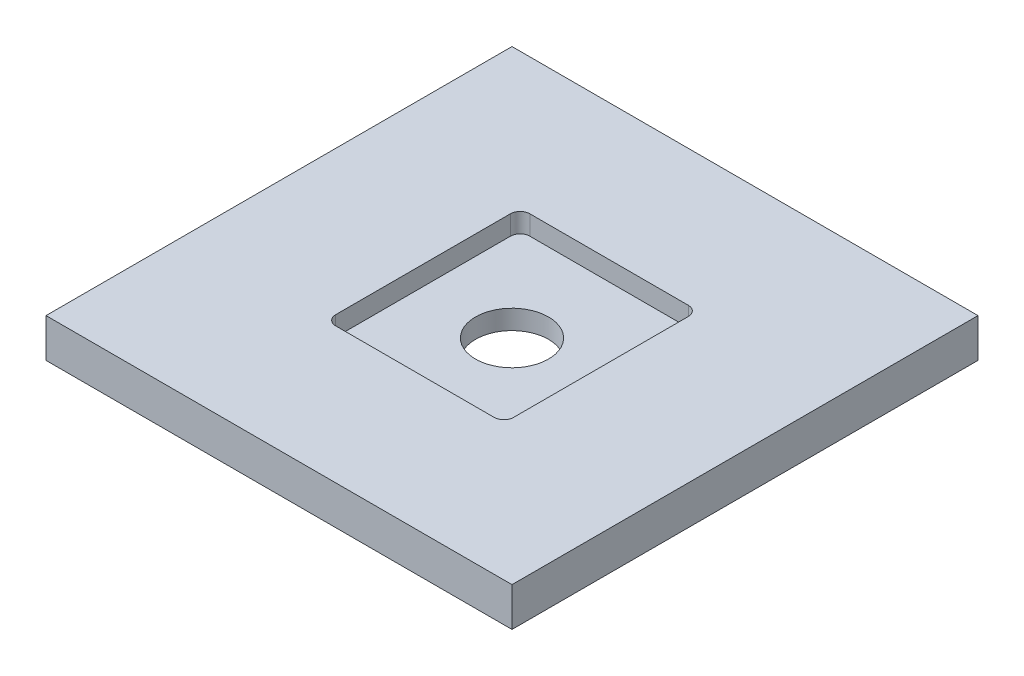
ISO-10303-21;
HEADER;
FILE_DESCRIPTION(('STEP AP214'),'2;1');
FILE_NAME('part.step','',(''),(''),'','','');
FILE_SCHEMA(('AUTOMOTIVE_DESIGN { 1 0 10303 214 1 1 1 1 }'));
ENDSEC;
DATA;
#1=APPLICATION_CONTEXT('core data for automotive mechanical design processes');
#2=APPLICATION_PROTOCOL_DEFINITION('international standard','automotive_design',2000,#1);
#3=PRODUCT_CONTEXT('',#1,'mechanical');
#4=PRODUCT('Part','Part','',(#3));
#5=PRODUCT_RELATED_PRODUCT_CATEGORY('part','',(#4));
#6=PRODUCT_DEFINITION_FORMATION('','',#4);
#7=PRODUCT_DEFINITION_CONTEXT('part definition',#1,'design');
#8=PRODUCT_DEFINITION('design','',#6,#7);
#9=PRODUCT_DEFINITION_SHAPE('','',#8);
#10=(LENGTH_UNIT() NAMED_UNIT(*) SI_UNIT(.MILLI.,.METRE.));
#11=(NAMED_UNIT(*) PLANE_ANGLE_UNIT() SI_UNIT($,.RADIAN.));
#12=(NAMED_UNIT(*) SI_UNIT($,.STERADIAN.) SOLID_ANGLE_UNIT());
#13=UNCERTAINTY_MEASURE_WITH_UNIT(LENGTH_MEASURE(1.E-05),#10,'distance_accuracy_value','');
#14=(GEOMETRIC_REPRESENTATION_CONTEXT(3) GLOBAL_UNCERTAINTY_ASSIGNED_CONTEXT((#13)) GLOBAL_UNIT_ASSIGNED_CONTEXT((#10,
#11,#12)) REPRESENTATION_CONTEXT('',''));
#15=CARTESIAN_POINT('',(0.,0.,0.));
#16=DIRECTION('',(0.,0.,1.));
#17=DIRECTION('',(1.,0.,0.));
#18=AXIS2_PLACEMENT_3D('',#15,#16,#17);
#19=CARTESIAN_POINT('',(0.,12.7,0.));
#20=DIRECTION('',(0.,1.,0.));
#21=DIRECTION('',(0.,0.,1.));
#22=AXIS2_PLACEMENT_3D('',#19,#20,#21);
#23=PLANE('',#22);
#24=DIRECTION('',(0.,0.,-1.));
#25=VECTOR('',#24,1.);
#26=CARTESIAN_POINT('',(152.4,12.7,-152.4));
#27=LINE('',#26,#25);
#28=CARTESIAN_POINT('',(152.4,12.7,152.4));
#29=VERTEX_POINT('',#28);
#30=CARTESIAN_POINT('',(152.4,12.7,-152.4));
#31=VERTEX_POINT('',#30);
#32=EDGE_CURVE('E173',#29,#31,#27,.T.);
#33=ORIENTED_EDGE('',*,*,#32,.T.);
#34=DIRECTION('',(-1.,0.,0.));
#35=VECTOR('',#34,1.);
#36=CARTESIAN_POINT('',(-152.4,12.7,-152.4));
#37=LINE('',#36,#35);
#38=CARTESIAN_POINT('',(-152.4,12.7,-152.4));
#39=VERTEX_POINT('',#38);
#40=EDGE_CURVE('E186',#31,#39,#37,.T.);
#41=ORIENTED_EDGE('',*,*,#40,.T.);
#42=DIRECTION('',(0.,0.,1.));
#43=VECTOR('',#42,1.);
#44=CARTESIAN_POINT('',(-152.4,12.7,-152.4));
#45=LINE('',#44,#43);
#46=CARTESIAN_POINT('',(-152.4,12.7,152.4));
#47=VERTEX_POINT('',#46);
#48=EDGE_CURVE('E132',#39,#47,#45,.T.);
#49=ORIENTED_EDGE('',*,*,#48,.T.);
#50=DIRECTION('',(1.,0.,0.));
#51=VECTOR('',#50,1.);
#52=CARTESIAN_POINT('',(-152.4,12.7,152.4));
#53=LINE('',#52,#51);
#54=EDGE_CURVE('E189',#47,#29,#53,.T.);
#55=ORIENTED_EDGE('',*,*,#54,.T.);
#56=EDGE_LOOP('',(#33,#41,#49,#55));
#57=FACE_BOUND('',#56,.T.);
#58=DIRECTION('',(-1.,0.,0.));
#59=VECTOR('',#58,1.);
#60=CARTESIAN_POINT('',(-58.1853153841649,12.7,-63.5));
#61=LINE('',#60,#59);
#62=CARTESIAN_POINT('',(51.835315384165,12.7,-63.5));
#63=VERTEX_POINT('',#62);
#64=CARTESIAN_POINT('',(-51.8353153841649,12.7,-63.5));
#65=VERTEX_POINT('',#64);
#66=EDGE_CURVE('E164',#63,#65,#61,.T.);
#67=ORIENTED_EDGE('',*,*,#66,.F.);
#68=CARTESIAN_POINT('',(51.835315384165,12.7,-57.15));
#69=DIRECTION('',(0.,1.,0.));
#70=DIRECTION('',(0.,0.,1.));
#71=AXIS2_PLACEMENT_3D('',#68,#69,#70);
#72=CIRCLE('',#71,6.35);
#73=CARTESIAN_POINT('',(58.185315384165,12.7,-57.15));
#74=VERTEX_POINT('',#73);
#75=EDGE_CURVE('E227',#63,#74,#72,.F.);
#76=ORIENTED_EDGE('',*,*,#75,.T.);
#77=DIRECTION('',(0.,0.,-1.));
#78=VECTOR('',#77,1.);
#79=CARTESIAN_POINT('',(58.185315384165,12.7,63.5));
#80=LINE('',#79,#78);
#81=CARTESIAN_POINT('',(58.185315384165,12.7,57.15));
#82=VERTEX_POINT('',#81);
#83=EDGE_CURVE('E161',#82,#74,#80,.T.);
#84=ORIENTED_EDGE('',*,*,#83,.F.);
#85=CARTESIAN_POINT('',(51.835315384165,12.7,57.15));
#86=DIRECTION('',(0.,1.,0.));
#87=DIRECTION('',(0.,0.,1.));
#88=AXIS2_PLACEMENT_3D('',#85,#86,#87);
#89=CIRCLE('',#88,6.35);
#90=CARTESIAN_POINT('',(51.835315384165,12.7,63.5));
#91=VERTEX_POINT('',#90);
#92=EDGE_CURVE('E222',#82,#91,#89,.F.);
#93=ORIENTED_EDGE('',*,*,#92,.T.);
#94=DIRECTION('',(1.,0.,0.));
#95=VECTOR('',#94,1.);
#96=CARTESIAN_POINT('',(-58.1853153841649,12.7,63.5));
#97=LINE('',#96,#95);
#98=CARTESIAN_POINT('',(-51.8353153841649,12.7,63.5));
#99=VERTEX_POINT('',#98);
#100=EDGE_CURVE('E170',#99,#91,#97,.T.);
#101=ORIENTED_EDGE('',*,*,#100,.F.);
#102=CARTESIAN_POINT('',(-51.8353153841649,12.7,57.15));
#103=DIRECTION('',(0.,1.,0.));
#104=DIRECTION('',(0.,0.,1.));
#105=AXIS2_PLACEMENT_3D('',#102,#103,#104);
#106=CIRCLE('',#105,6.35);
#107=CARTESIAN_POINT('',(-58.1853153841649,12.7,57.15));
#108=VERTEX_POINT('',#107);
#109=EDGE_CURVE('E217',#99,#108,#106,.F.);
#110=ORIENTED_EDGE('',*,*,#109,.T.);
#111=DIRECTION('',(0.,0.,1.));
#112=VECTOR('',#111,1.);
#113=CARTESIAN_POINT('',(-58.1853153841649,12.7,63.5));
#114=LINE('',#113,#112);
#115=CARTESIAN_POINT('',(-58.1853153841649,12.7,-57.15));
#116=VERTEX_POINT('',#115);
#117=EDGE_CURVE('E167',#116,#108,#114,.T.);
#118=ORIENTED_EDGE('',*,*,#117,.F.);
#119=CARTESIAN_POINT('',(-51.8353153841649,12.7,-57.15));
#120=DIRECTION('',(0.,1.,0.));
#121=DIRECTION('',(0.,0.,1.));
#122=AXIS2_PLACEMENT_3D('',#119,#120,#121);
#123=CIRCLE('',#122,6.35);
#124=EDGE_CURVE('E11',#116,#65,#123,.F.);
#125=ORIENTED_EDGE('',*,*,#124,.T.);
#126=EDGE_LOOP('',(#67,#76,#84,#93,#101,#110,#118,#125));
#127=FACE_BOUND('',#126,.T.);
#128=ADVANCED_FACE('F37',(#57,#127),#23,.T.);
#129=CARTESIAN_POINT('',(152.4,12.7,-152.4));
#130=DIRECTION('',(-1.,0.,0.));
#131=DIRECTION('',(0.,0.,1.));
#132=AXIS2_PLACEMENT_3D('',#129,#130,#131);
#133=PLANE('',#132);
#134=DIRECTION('',(0.,-1.,0.));
#135=VECTOR('',#134,1.);
#136=CARTESIAN_POINT('',(152.4,12.7,152.4));
#137=LINE('',#136,#135);
#138=CARTESIAN_POINT('',(152.4,-12.7,152.4));
#139=VERTEX_POINT('',#138);
#140=EDGE_CURVE('E191',#29,#139,#137,.T.);
#141=ORIENTED_EDGE('',*,*,#140,.T.);
#142=DIRECTION('',(0.,0.,1.));
#143=VECTOR('',#142,1.);
#144=CARTESIAN_POINT('',(152.4,-12.7,152.4));
#145=LINE('',#144,#143);
#146=CARTESIAN_POINT('',(152.4,-12.7,-152.4));
#147=VERTEX_POINT('',#146);
#148=EDGE_CURVE('E144',#147,#139,#145,.T.);
#149=ORIENTED_EDGE('',*,*,#148,.F.);
#150=DIRECTION('',(0.,-1.,0.));
#151=VECTOR('',#150,1.);
#152=CARTESIAN_POINT('',(152.4,12.7,-152.4));
#153=LINE('',#152,#151);
#154=EDGE_CURVE('E134',#31,#147,#153,.T.);
#155=ORIENTED_EDGE('',*,*,#154,.F.);
#156=ORIENTED_EDGE('',*,*,#32,.F.);
#157=EDGE_LOOP('',(#141,#149,#155,#156));
#158=FACE_BOUND('',#157,.T.);
#159=ADVANCED_FACE('F266',(#158),#133,.F.);
#160=CARTESIAN_POINT('',(-152.4,12.7,-152.4));
#161=DIRECTION('',(0.,0.,1.));
#162=DIRECTION('',(1.,0.,0.));
#163=AXIS2_PLACEMENT_3D('',#160,#161,#162);
#164=PLANE('',#163);
#165=ORIENTED_EDGE('',*,*,#154,.T.);
#166=DIRECTION('',(1.,0.,0.));
#167=VECTOR('',#166,1.);
#168=CARTESIAN_POINT('',(152.4,-12.7,-152.4));
#169=LINE('',#168,#167);
#170=CARTESIAN_POINT('',(-152.4,-12.7,-152.4));
#171=VERTEX_POINT('',#170);
#172=EDGE_CURVE('E138',#171,#147,#169,.T.);
#173=ORIENTED_EDGE('',*,*,#172,.F.);
#174=DIRECTION('',(0.,-1.,0.));
#175=VECTOR('',#174,1.);
#176=CARTESIAN_POINT('',(-152.4,12.7,-152.4));
#177=LINE('',#176,#175);
#178=EDGE_CURVE('E126',#39,#171,#177,.T.);
#179=ORIENTED_EDGE('',*,*,#178,.F.);
#180=ORIENTED_EDGE('',*,*,#40,.F.);
#181=EDGE_LOOP('',(#165,#173,#179,#180));
#182=FACE_BOUND('',#181,.T.);
#183=ADVANCED_FACE('F139',(#182),#164,.F.);
#184=CARTESIAN_POINT('',(-152.4,12.7,-152.4));
#185=DIRECTION('',(1.,0.,0.));
#186=DIRECTION('',(0.,0.,-1.));
#187=AXIS2_PLACEMENT_3D('',#184,#185,#186);
#188=PLANE('',#187);
#189=ORIENTED_EDGE('',*,*,#178,.T.);
#190=DIRECTION('',(0.,0.,-1.));
#191=VECTOR('',#190,1.);
#192=CARTESIAN_POINT('',(-152.4,-12.7,152.4));
#193=LINE('',#192,#191);
#194=CARTESIAN_POINT('',(-152.4,-12.7,152.4));
#195=VERTEX_POINT('',#194);
#196=EDGE_CURVE('E131',#195,#171,#193,.T.);
#197=ORIENTED_EDGE('',*,*,#196,.F.);
#198=DIRECTION('',(0.,-1.,0.));
#199=VECTOR('',#198,1.);
#200=CARTESIAN_POINT('',(-152.4,12.7,152.4));
#201=LINE('',#200,#199);
#202=EDGE_CURVE('E135',#47,#195,#201,.T.);
#203=ORIENTED_EDGE('',*,*,#202,.F.);
#204=ORIENTED_EDGE('',*,*,#48,.F.);
#205=EDGE_LOOP('',(#189,#197,#203,#204));
#206=FACE_BOUND('',#205,.T.);
#207=ADVANCED_FACE('F128',(#206),#188,.F.);
#208=CARTESIAN_POINT('',(-152.4,12.7,152.4));
#209=DIRECTION('',(0.,0.,-1.));
#210=DIRECTION('',(-1.,0.,0.));
#211=AXIS2_PLACEMENT_3D('',#208,#209,#210);
#212=PLANE('',#211);
#213=ORIENTED_EDGE('',*,*,#202,.T.);
#214=DIRECTION('',(-1.,0.,0.));
#215=VECTOR('',#214,1.);
#216=CARTESIAN_POINT('',(152.4,-12.7,152.4));
#217=LINE('',#216,#215);
#218=EDGE_CURVE('E150',#139,#195,#217,.T.);
#219=ORIENTED_EDGE('',*,*,#218,.F.);
#220=ORIENTED_EDGE('',*,*,#140,.F.);
#221=ORIENTED_EDGE('',*,*,#54,.F.);
#222=EDGE_LOOP('',(#213,#219,#220,#221));
#223=FACE_BOUND('',#222,.T.);
#224=ADVANCED_FACE('F277',(#223),#212,.F.);
#225=CARTESIAN_POINT('',(58.185315384165,12.7,63.5));
#226=DIRECTION('',(-1.,0.,0.));
#227=DIRECTION('',(0.,0.,1.));
#228=AXIS2_PLACEMENT_3D('',#225,#226,#227);
#229=PLANE('',#228);
#230=DIRECTION('',(0.,0.,-1.));
#231=VECTOR('',#230,1.);
#232=CARTESIAN_POINT('',(58.185315384165,0.,63.5));
#233=LINE('',#232,#231);
#234=CARTESIAN_POINT('',(58.185315384165,0.,57.15));
#235=VERTEX_POINT('',#234);
#236=CARTESIAN_POINT('',(58.185315384165,0.,-57.15));
#237=VERTEX_POINT('',#236);
#238=EDGE_CURVE('E160',#235,#237,#233,.T.);
#239=ORIENTED_EDGE('',*,*,#238,.F.);
#240=DIRECTION('',(0.,-1.,0.));
#241=VECTOR('',#240,1.);
#242=CARTESIAN_POINT('',(58.185315384165,12.7,57.15));
#243=LINE('',#242,#241);
#244=EDGE_CURVE('E208',#235,#82,#243,.F.);
#245=ORIENTED_EDGE('',*,*,#244,.T.);
#246=ORIENTED_EDGE('',*,*,#83,.T.);
#247=DIRECTION('',(0.,-1.,0.));
#248=VECTOR('',#247,1.);
#249=CARTESIAN_POINT('',(58.185315384165,0.,-57.15));
#250=LINE('',#249,#248);
#251=EDGE_CURVE('E205',#74,#237,#250,.T.);
#252=ORIENTED_EDGE('',*,*,#251,.T.);
#253=EDGE_LOOP('',(#239,#245,#246,#252));
#254=FACE_BOUND('',#253,.T.);
#255=ADVANCED_FACE('F241',(#254),#229,.T.);
#256=CARTESIAN_POINT('',(-58.1853153841649,12.7,-63.5));
#257=DIRECTION('',(0.,0.,1.));
#258=DIRECTION('',(1.,0.,0.));
#259=AXIS2_PLACEMENT_3D('',#256,#257,#258);
#260=PLANE('',#259);
#261=DIRECTION('',(-1.,0.,0.));
#262=VECTOR('',#261,1.);
#263=CARTESIAN_POINT('',(-58.1853153841649,0.,-63.5));
#264=LINE('',#263,#262);
#265=CARTESIAN_POINT('',(51.835315384165,0.,-63.5));
#266=VERTEX_POINT('',#265);
#267=CARTESIAN_POINT('',(-51.8353153841649,0.,-63.5));
#268=VERTEX_POINT('',#267);
#269=EDGE_CURVE('E176',#266,#268,#264,.T.);
#270=ORIENTED_EDGE('',*,*,#269,.F.);
#271=DIRECTION('',(0.,-1.,0.));
#272=VECTOR('',#271,1.);
#273=CARTESIAN_POINT('',(51.835315384165,12.7,-63.5));
#274=LINE('',#273,#272);
#275=EDGE_CURVE('E57',#266,#63,#274,.F.);
#276=ORIENTED_EDGE('',*,*,#275,.T.);
#277=ORIENTED_EDGE('',*,*,#66,.T.);
#278=DIRECTION('',(0.,-1.,0.));
#279=VECTOR('',#278,1.);
#280=CARTESIAN_POINT('',(-51.8353153841649,0.,-63.5));
#281=LINE('',#280,#279);
#282=EDGE_CURVE('E210',#65,#268,#281,.T.);
#283=ORIENTED_EDGE('',*,*,#282,.T.);
#284=EDGE_LOOP('',(#270,#276,#277,#283));
#285=FACE_BOUND('',#284,.T.);
#286=ADVANCED_FACE('F234',(#285),#260,.T.);
#287=CARTESIAN_POINT('',(-58.1853153841649,12.7,63.5));
#288=DIRECTION('',(1.,0.,0.));
#289=DIRECTION('',(0.,0.,-1.));
#290=AXIS2_PLACEMENT_3D('',#287,#288,#289);
#291=PLANE('',#290);
#292=ORIENTED_EDGE('',*,*,#117,.T.);
#293=DIRECTION('',(0.,-1.,0.));
#294=VECTOR('',#293,1.);
#295=CARTESIAN_POINT('',(-58.1853153841649,0.,57.15));
#296=LINE('',#295,#294);
#297=CARTESIAN_POINT('',(-58.1853153841649,0.,57.15));
#298=VERTEX_POINT('',#297);
#299=EDGE_CURVE('E197',#108,#298,#296,.T.);
#300=ORIENTED_EDGE('',*,*,#299,.T.);
#301=DIRECTION('',(0.,0.,1.));
#302=VECTOR('',#301,1.);
#303=CARTESIAN_POINT('',(-58.1853153841649,0.,63.5));
#304=LINE('',#303,#302);
#305=CARTESIAN_POINT('',(-58.1853153841649,0.,-57.15));
#306=VERTEX_POINT('',#305);
#307=EDGE_CURVE('E179',#306,#298,#304,.T.);
#308=ORIENTED_EDGE('',*,*,#307,.F.);
#309=DIRECTION('',(0.,-1.,0.));
#310=VECTOR('',#309,1.);
#311=CARTESIAN_POINT('',(-58.1853153841649,12.7,-57.15));
#312=LINE('',#311,#310);
#313=EDGE_CURVE('E195',#306,#116,#312,.F.);
#314=ORIENTED_EDGE('',*,*,#313,.T.);
#315=EDGE_LOOP('',(#292,#300,#308,#314));
#316=FACE_BOUND('',#315,.T.);
#317=ADVANCED_FACE('F256',(#316),#291,.T.);
#318=CARTESIAN_POINT('',(-58.1853153841649,12.7,63.5));
#319=DIRECTION('',(0.,0.,-1.));
#320=DIRECTION('',(-1.,0.,0.));
#321=AXIS2_PLACEMENT_3D('',#318,#319,#320);
#322=PLANE('',#321);
#323=DIRECTION('',(1.,0.,0.));
#324=VECTOR('',#323,1.);
#325=CARTESIAN_POINT('',(-58.1853153841649,0.,63.5));
#326=LINE('',#325,#324);
#327=CARTESIAN_POINT('',(-51.8353153841649,0.,63.5));
#328=VERTEX_POINT('',#327);
#329=CARTESIAN_POINT('',(51.835315384165,0.,63.5));
#330=VERTEX_POINT('',#329);
#331=EDGE_CURVE('E165',#328,#330,#326,.T.);
#332=ORIENTED_EDGE('',*,*,#331,.F.);
#333=DIRECTION('',(0.,-1.,0.));
#334=VECTOR('',#333,1.);
#335=CARTESIAN_POINT('',(-51.8353153841649,12.7,63.5));
#336=LINE('',#335,#334);
#337=EDGE_CURVE('E203',#328,#99,#336,.F.);
#338=ORIENTED_EDGE('',*,*,#337,.T.);
#339=ORIENTED_EDGE('',*,*,#100,.T.);
#340=DIRECTION('',(0.,-1.,0.));
#341=VECTOR('',#340,1.);
#342=CARTESIAN_POINT('',(51.835315384165,0.,63.5));
#343=LINE('',#342,#341);
#344=EDGE_CURVE('E200',#91,#330,#343,.T.);
#345=ORIENTED_EDGE('',*,*,#344,.T.);
#346=EDGE_LOOP('',(#332,#338,#339,#345));
#347=FACE_BOUND('',#346,.T.);
#348=ADVANCED_FACE('F249',(#347),#322,.T.);
#349=CARTESIAN_POINT('',(-51.8353153841649,12.7,57.15));
#350=DIRECTION('',(0.,1.,0.));
#351=DIRECTION('',(0.,0.,1.));
#352=AXIS2_PLACEMENT_3D('',#349,#350,#351);
#353=CYLINDRICAL_SURFACE('',#352,6.35);
#354=ORIENTED_EDGE('',*,*,#109,.F.);
#355=ORIENTED_EDGE('',*,*,#337,.F.);
#356=CARTESIAN_POINT('',(-51.8353153841649,0.,57.15));
#357=DIRECTION('',(0.,1.,0.));
#358=DIRECTION('',(0.,0.,1.));
#359=AXIS2_PLACEMENT_3D('',#356,#357,#358);
#360=CIRCLE('',#359,6.35);
#361=EDGE_CURVE('E214',#298,#328,#360,.T.);
#362=ORIENTED_EDGE('',*,*,#361,.F.);
#363=ORIENTED_EDGE('',*,*,#299,.F.);
#364=EDGE_LOOP('',(#354,#355,#362,#363));
#365=FACE_BOUND('',#364,.T.);
#366=ADVANCED_FACE('F254',(#365),#353,.F.);
#367=CARTESIAN_POINT('',(51.835315384165,12.7,57.15));
#368=DIRECTION('',(0.,1.,0.));
#369=DIRECTION('',(0.,0.,1.));
#370=AXIS2_PLACEMENT_3D('',#367,#368,#369);
#371=CYLINDRICAL_SURFACE('',#370,6.35);
#372=ORIENTED_EDGE('',*,*,#92,.F.);
#373=ORIENTED_EDGE('',*,*,#244,.F.);
#374=CARTESIAN_POINT('',(51.835315384165,0.,57.15));
#375=DIRECTION('',(0.,1.,0.));
#376=DIRECTION('',(0.,0.,1.));
#377=AXIS2_PLACEMENT_3D('',#374,#375,#376);
#378=CIRCLE('',#377,6.35);
#379=EDGE_CURVE('E219',#330,#235,#378,.T.);
#380=ORIENTED_EDGE('',*,*,#379,.F.);
#381=ORIENTED_EDGE('',*,*,#344,.F.);
#382=EDGE_LOOP('',(#372,#373,#380,#381));
#383=FACE_BOUND('',#382,.T.);
#384=ADVANCED_FACE('F247',(#383),#371,.F.);
#385=CARTESIAN_POINT('',(51.835315384165,12.7,-57.15));
#386=DIRECTION('',(0.,1.,0.));
#387=DIRECTION('',(0.,0.,1.));
#388=AXIS2_PLACEMENT_3D('',#385,#386,#387);
#389=CYLINDRICAL_SURFACE('',#388,6.35);
#390=ORIENTED_EDGE('',*,*,#75,.F.);
#391=ORIENTED_EDGE('',*,*,#275,.F.);
#392=CARTESIAN_POINT('',(51.835315384165,0.,-57.15));
#393=DIRECTION('',(0.,1.,0.));
#394=DIRECTION('',(0.,0.,1.));
#395=AXIS2_PLACEMENT_3D('',#392,#393,#394);
#396=CIRCLE('',#395,6.35);
#397=EDGE_CURVE('E224',#237,#266,#396,.T.);
#398=ORIENTED_EDGE('',*,*,#397,.F.);
#399=ORIENTED_EDGE('',*,*,#251,.F.);
#400=EDGE_LOOP('',(#390,#391,#398,#399));
#401=FACE_BOUND('',#400,.T.);
#402=ADVANCED_FACE('F239',(#401),#389,.F.);
#403=CARTESIAN_POINT('',(-51.8353153841649,12.7,-57.15));
#404=DIRECTION('',(0.,1.,0.));
#405=DIRECTION('',(0.,0.,1.));
#406=AXIS2_PLACEMENT_3D('',#403,#404,#405);
#407=CYLINDRICAL_SURFACE('',#406,6.35);
#408=ORIENTED_EDGE('',*,*,#124,.F.);
#409=ORIENTED_EDGE('',*,*,#313,.F.);
#410=CARTESIAN_POINT('',(-51.8353153841649,0.,-57.15));
#411=DIRECTION('',(0.,1.,0.));
#412=DIRECTION('',(0.,0.,1.));
#413=AXIS2_PLACEMENT_3D('',#410,#411,#412);
#414=CIRCLE('',#413,6.35);
#415=EDGE_CURVE('E45',#268,#306,#414,.T.);
#416=ORIENTED_EDGE('',*,*,#415,.F.);
#417=ORIENTED_EDGE('',*,*,#282,.F.);
#418=EDGE_LOOP('',(#408,#409,#416,#417));
#419=FACE_BOUND('',#418,.T.);
#420=ADVANCED_FACE('F39',(#419),#407,.F.);
#421=CARTESIAN_POINT('',(0.,0.,0.));
#422=DIRECTION('',(0.,1.,0.));
#423=DIRECTION('',(0.,0.,1.));
#424=AXIS2_PLACEMENT_3D('',#421,#422,#423);
#425=PLANE('',#424);
#426=CARTESIAN_POINT('',(0.,0.,0.));
#427=DIRECTION('',(0.,-1.,0.));
#428=DIRECTION('',(0.,0.,-1.));
#429=AXIS2_PLACEMENT_3D('',#426,#427,#428);
#430=CIRCLE('',#429,23.876);
#431=CARTESIAN_POINT('',(0.,0.,-23.876));
#432=VERTEX_POINT('',#431);
#433=EDGE_CURVE('E154',#432,#432,#430,.T.);
#434=ORIENTED_EDGE('',*,*,#433,.T.);
#435=EDGE_LOOP('',(#434));
#436=FACE_BOUND('',#435,.T.);
#437=ORIENTED_EDGE('',*,*,#361,.T.);
#438=ORIENTED_EDGE('',*,*,#331,.T.);
#439=ORIENTED_EDGE('',*,*,#379,.T.);
#440=ORIENTED_EDGE('',*,*,#238,.T.);
#441=ORIENTED_EDGE('',*,*,#397,.T.);
#442=ORIENTED_EDGE('',*,*,#269,.T.);
#443=ORIENTED_EDGE('',*,*,#415,.T.);
#444=ORIENTED_EDGE('',*,*,#307,.T.);
#445=EDGE_LOOP('',(#437,#438,#439,#440,#441,#442,#443,#444));
#446=FACE_BOUND('',#445,.T.);
#447=ADVANCED_FACE('F230',(#436,#446),#425,.T.);
#448=CARTESIAN_POINT('',(0.,-12.7,0.));
#449=DIRECTION('',(0.,1.,0.));
#450=DIRECTION('',(0.,0.,1.));
#451=AXIS2_PLACEMENT_3D('',#448,#449,#450);
#452=PLANE('',#451);
#453=ORIENTED_EDGE('',*,*,#196,.T.);
#454=ORIENTED_EDGE('',*,*,#172,.T.);
#455=ORIENTED_EDGE('',*,*,#148,.T.);
#456=ORIENTED_EDGE('',*,*,#218,.T.);
#457=EDGE_LOOP('',(#453,#454,#455,#456));
#458=FACE_BOUND('',#457,.T.);
#459=CARTESIAN_POINT('',(0.,-12.7,0.));
#460=DIRECTION('',(0.,-1.,0.));
#461=DIRECTION('',(0.,0.,-1.));
#462=AXIS2_PLACEMENT_3D('',#459,#460,#461);
#463=CIRCLE('',#462,23.876);
#464=CARTESIAN_POINT('',(0.,-12.7,-23.876));
#465=VERTEX_POINT('',#464);
#466=EDGE_CURVE('E151',#465,#465,#463,.T.);
#467=ORIENTED_EDGE('',*,*,#466,.F.);
#468=EDGE_LOOP('',(#467));
#469=FACE_BOUND('',#468,.T.);
#470=ADVANCED_FACE('F147',(#458,#469),#452,.F.);
#471=CARTESIAN_POINT('',(0.,-12.7,0.));
#472=DIRECTION('',(0.,1.,0.));
#473=DIRECTION('',(0.,0.,1.));
#474=AXIS2_PLACEMENT_3D('',#471,#472,#473);
#475=CYLINDRICAL_SURFACE('',#474,23.876);
#476=ORIENTED_EDGE('',*,*,#466,.T.);
#477=EDGE_LOOP('',(#476));
#478=FACE_BOUND('',#477,.T.);
#479=ORIENTED_EDGE('',*,*,#433,.F.);
#480=EDGE_LOOP('',(#479));
#481=FACE_BOUND('',#480,.T.);
#482=ADVANCED_FACE('F300',(#478,#481),#475,.F.);
#483=CLOSED_SHELL('',(#128,#159,#183,#207,#224,#255,#286,#317,#348,#366,#384,#402,#420,#447,
#470,#482));
#484=MANIFOLD_SOLID_BREP('B2',#483);
#485=ADVANCED_BREP_SHAPE_REPRESENTATION('',(#18,#484),#14);
#486=SHAPE_DEFINITION_REPRESENTATION(#9,#485);
ENDSEC;
END-ISO-10303-21;
